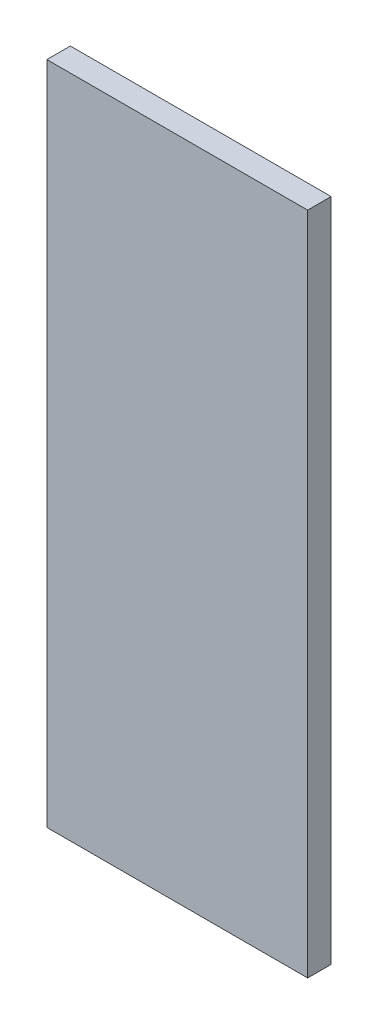
ISO-10303-21;
HEADER;
FILE_DESCRIPTION(('STEP AP214'),'2;1');
FILE_NAME('part.step','',(''),(''),'','','');
FILE_SCHEMA(('AUTOMOTIVE_DESIGN { 1 0 10303 214 1 1 1 1 }'));
ENDSEC;
DATA;
#1=APPLICATION_CONTEXT('core data for automotive mechanical design processes');
#2=APPLICATION_PROTOCOL_DEFINITION('international standard','automotive_design',2000,#1);
#3=PRODUCT_CONTEXT('',#1,'mechanical');
#4=PRODUCT('Part','Part','',(#3));
#5=PRODUCT_RELATED_PRODUCT_CATEGORY('part','',(#4));
#6=PRODUCT_DEFINITION_FORMATION('','',#4);
#7=PRODUCT_DEFINITION_CONTEXT('part definition',#1,'design');
#8=PRODUCT_DEFINITION('design','',#6,#7);
#9=PRODUCT_DEFINITION_SHAPE('','',#8);
#10=(LENGTH_UNIT() NAMED_UNIT(*) SI_UNIT(.MILLI.,.METRE.));
#11=(NAMED_UNIT(*) PLANE_ANGLE_UNIT() SI_UNIT($,.RADIAN.));
#12=(NAMED_UNIT(*) SI_UNIT($,.STERADIAN.) SOLID_ANGLE_UNIT());
#13=UNCERTAINTY_MEASURE_WITH_UNIT(LENGTH_MEASURE(1.E-05),#10,'distance_accuracy_value','');
#14=(GEOMETRIC_REPRESENTATION_CONTEXT(3) GLOBAL_UNCERTAINTY_ASSIGNED_CONTEXT((#13)) GLOBAL_UNIT_ASSIGNED_CONTEXT((#10,
#11,#12)) REPRESENTATION_CONTEXT('',''));
#15=CARTESIAN_POINT('',(0.,0.,0.));
#16=DIRECTION('',(0.,0.,1.));
#17=DIRECTION('',(1.,0.,0.));
#18=AXIS2_PLACEMENT_3D('',#15,#16,#17);
#19=CARTESIAN_POINT('',(100.,255.,18.));
#20=DIRECTION('',(-1.,0.,0.));
#21=DIRECTION('',(0.,-1.,0.));
#22=AXIS2_PLACEMENT_3D('',#19,#20,#21);
#23=PLANE('',#22);
#24=DIRECTION('',(0.,1.,0.));
#25=VECTOR('',#24,1.);
#26=CARTESIAN_POINT('',(100.,255.,0.));
#27=LINE('',#26,#25);
#28=CARTESIAN_POINT('',(100.,-255.,0.));
#29=VERTEX_POINT('',#28);
#30=CARTESIAN_POINT('',(100.,255.,0.));
#31=VERTEX_POINT('',#30);
#32=EDGE_CURVE('E96',#29,#31,#27,.T.);
#33=ORIENTED_EDGE('',*,*,#32,.T.);
#34=DIRECTION('',(0.,0.,-1.));
#35=VECTOR('',#34,1.);
#36=CARTESIAN_POINT('',(100.,255.,18.));
#37=LINE('',#36,#35);
#38=CARTESIAN_POINT('',(100.,255.,18.));
#39=VERTEX_POINT('',#38);
#40=EDGE_CURVE('E11',#39,#31,#37,.T.);
#41=ORIENTED_EDGE('',*,*,#40,.F.);
#42=DIRECTION('',(0.,1.,0.));
#43=VECTOR('',#42,1.);
#44=CARTESIAN_POINT('',(100.,255.,18.));
#45=LINE('',#44,#43);
#46=CARTESIAN_POINT('',(100.,-255.,18.));
#47=VERTEX_POINT('',#46);
#48=EDGE_CURVE('E84',#47,#39,#45,.T.);
#49=ORIENTED_EDGE('',*,*,#48,.F.);
#50=DIRECTION('',(0.,0.,-1.));
#51=VECTOR('',#50,1.);
#52=CARTESIAN_POINT('',(100.,-255.,18.));
#53=LINE('',#52,#51);
#54=EDGE_CURVE('E92',#47,#29,#53,.T.);
#55=ORIENTED_EDGE('',*,*,#54,.T.);
#56=EDGE_LOOP('',(#33,#41,#49,#55));
#57=FACE_BOUND('',#56,.T.);
#58=ADVANCED_FACE('F33',(#57),#23,.F.);
#59=CARTESIAN_POINT('',(-100.,255.,18.));
#60=DIRECTION('',(0.,-1.,0.));
#61=DIRECTION('',(0.,0.,-1.));
#62=AXIS2_PLACEMENT_3D('',#59,#60,#61);
#63=PLANE('',#62);
#64=DIRECTION('',(-1.,0.,0.));
#65=VECTOR('',#64,1.);
#66=CARTESIAN_POINT('',(-100.,255.,0.));
#67=LINE('',#66,#65);
#68=CARTESIAN_POINT('',(-100.,255.,0.));
#69=VERTEX_POINT('',#68);
#70=EDGE_CURVE('E88',#31,#69,#67,.T.);
#71=ORIENTED_EDGE('',*,*,#70,.T.);
#72=DIRECTION('',(0.,0.,-1.));
#73=VECTOR('',#72,1.);
#74=CARTESIAN_POINT('',(-100.,255.,18.));
#75=LINE('',#74,#73);
#76=CARTESIAN_POINT('',(-100.,255.,18.));
#77=VERTEX_POINT('',#76);
#78=EDGE_CURVE('E41',#77,#69,#75,.T.);
#79=ORIENTED_EDGE('',*,*,#78,.F.);
#80=DIRECTION('',(-1.,0.,0.));
#81=VECTOR('',#80,1.);
#82=CARTESIAN_POINT('',(-100.,255.,18.));
#83=LINE('',#82,#81);
#84=EDGE_CURVE('E79',#39,#77,#83,.T.);
#85=ORIENTED_EDGE('',*,*,#84,.F.);
#86=ORIENTED_EDGE('',*,*,#40,.T.);
#87=EDGE_LOOP('',(#71,#79,#85,#86));
#88=FACE_BOUND('',#87,.T.);
#89=ADVANCED_FACE('F87',(#88),#63,.F.);
#90=CARTESIAN_POINT('',(-100.,255.,18.));
#91=DIRECTION('',(1.,0.,0.));
#92=DIRECTION('',(0.,1.,0.));
#93=AXIS2_PLACEMENT_3D('',#90,#91,#92);
#94=PLANE('',#93);
#95=DIRECTION('',(0.,-1.,0.));
#96=VECTOR('',#95,1.);
#97=CARTESIAN_POINT('',(-100.,255.,0.));
#98=LINE('',#97,#96);
#99=CARTESIAN_POINT('',(-99.9999999999999,-255.,0.));
#100=VERTEX_POINT('',#99);
#101=EDGE_CURVE('E66',#69,#100,#98,.T.);
#102=ORIENTED_EDGE('',*,*,#101,.T.);
#103=DIRECTION('',(0.,0.,-1.));
#104=VECTOR('',#103,1.);
#105=CARTESIAN_POINT('',(-99.9999999999999,-255.,18.));
#106=LINE('',#105,#104);
#107=CARTESIAN_POINT('',(-99.9999999999999,-255.,18.));
#108=VERTEX_POINT('',#107);
#109=EDGE_CURVE('E89',#108,#100,#106,.T.);
#110=ORIENTED_EDGE('',*,*,#109,.F.);
#111=DIRECTION('',(0.,-1.,0.));
#112=VECTOR('',#111,1.);
#113=CARTESIAN_POINT('',(-100.,255.,18.));
#114=LINE('',#113,#112);
#115=EDGE_CURVE('E82',#77,#108,#114,.T.);
#116=ORIENTED_EDGE('',*,*,#115,.F.);
#117=ORIENTED_EDGE('',*,*,#78,.T.);
#118=EDGE_LOOP('',(#102,#110,#116,#117));
#119=FACE_BOUND('',#118,.T.);
#120=ADVANCED_FACE('F90',(#119),#94,.F.);
#121=CARTESIAN_POINT('',(-99.9999999999999,-255.,18.));
#122=DIRECTION('',(0.,1.,0.));
#123=DIRECTION('',(0.,0.,1.));
#124=AXIS2_PLACEMENT_3D('',#121,#122,#123);
#125=PLANE('',#124);
#126=DIRECTION('',(1.,0.,0.));
#127=VECTOR('',#126,1.);
#128=CARTESIAN_POINT('',(-99.9999999999999,-255.,0.));
#129=LINE('',#128,#127);
#130=EDGE_CURVE('E72',#100,#29,#129,.T.);
#131=ORIENTED_EDGE('',*,*,#130,.T.);
#132=ORIENTED_EDGE('',*,*,#54,.F.);
#133=DIRECTION('',(1.,0.,0.));
#134=VECTOR('',#133,1.);
#135=CARTESIAN_POINT('',(-99.9999999999999,-255.,18.));
#136=LINE('',#135,#134);
#137=EDGE_CURVE('E49',#108,#47,#136,.T.);
#138=ORIENTED_EDGE('',*,*,#137,.F.);
#139=ORIENTED_EDGE('',*,*,#109,.T.);
#140=EDGE_LOOP('',(#131,#132,#138,#139));
#141=FACE_BOUND('',#140,.T.);
#142=ADVANCED_FACE('F103',(#141),#125,.F.);
#143=CARTESIAN_POINT('',(0.,0.,18.));
#144=DIRECTION('',(0.,0.,1.));
#145=DIRECTION('',(1.,0.,0.));
#146=AXIS2_PLACEMENT_3D('',#143,#144,#145);
#147=PLANE('',#146);
#148=ORIENTED_EDGE('',*,*,#48,.T.);
#149=ORIENTED_EDGE('',*,*,#84,.T.);
#150=ORIENTED_EDGE('',*,*,#115,.T.);
#151=ORIENTED_EDGE('',*,*,#137,.T.);
#152=EDGE_LOOP('',(#148,#149,#150,#151));
#153=FACE_BOUND('',#152,.T.);
#154=ADVANCED_FACE('F80',(#153),#147,.T.);
#155=CARTESIAN_POINT('',(0.,0.,0.));
#156=DIRECTION('',(0.,0.,1.));
#157=DIRECTION('',(1.,0.,0.));
#158=AXIS2_PLACEMENT_3D('',#155,#156,#157);
#159=PLANE('',#158);
#160=ORIENTED_EDGE('',*,*,#32,.F.);
#161=ORIENTED_EDGE('',*,*,#130,.F.);
#162=ORIENTED_EDGE('',*,*,#101,.F.);
#163=ORIENTED_EDGE('',*,*,#70,.F.);
#164=EDGE_LOOP('',(#160,#161,#162,#163));
#165=FACE_BOUND('',#164,.T.);
#166=ADVANCED_FACE('F106',(#165),#159,.F.);
#167=CLOSED_SHELL('',(#58,#89,#120,#142,#154,#166));
#168=MANIFOLD_SOLID_BREP('B2',#167);
#169=ADVANCED_BREP_SHAPE_REPRESENTATION('',(#18,#168),#14);
#170=SHAPE_DEFINITION_REPRESENTATION(#9,#169);
ENDSEC;
END-ISO-10303-21;
